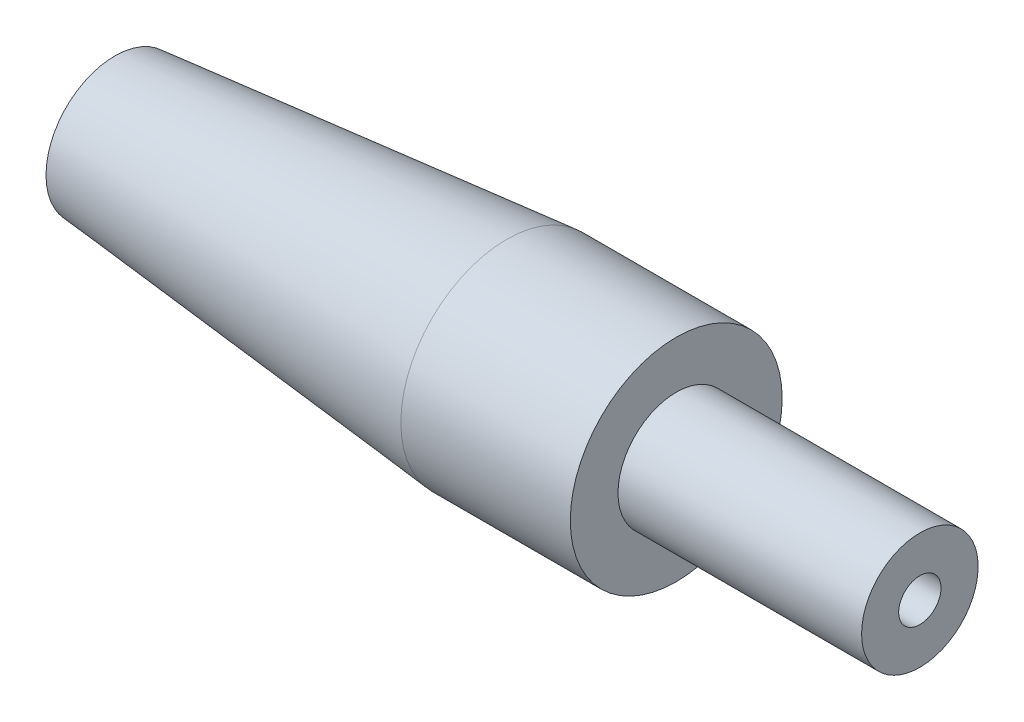
ISO-10303-21;
HEADER;
FILE_DESCRIPTION(('STEP AP214'),'2;1');
FILE_NAME('part.step','',(''),(''),'','','');
FILE_SCHEMA(('AUTOMOTIVE_DESIGN { 1 0 10303 214 1 1 1 1 }'));
ENDSEC;
DATA;
#1=APPLICATION_CONTEXT('core data for automotive mechanical design processes');
#2=APPLICATION_PROTOCOL_DEFINITION('international standard','automotive_design',2000,#1);
#3=PRODUCT_CONTEXT('',#1,'mechanical');
#4=PRODUCT('Part','Part','',(#3));
#5=PRODUCT_RELATED_PRODUCT_CATEGORY('part','',(#4));
#6=PRODUCT_DEFINITION_FORMATION('','',#4);
#7=PRODUCT_DEFINITION_CONTEXT('part definition',#1,'design');
#8=PRODUCT_DEFINITION('design','',#6,#7);
#9=PRODUCT_DEFINITION_SHAPE('','',#8);
#10=(LENGTH_UNIT() NAMED_UNIT(*) SI_UNIT(.MILLI.,.METRE.));
#11=(NAMED_UNIT(*) PLANE_ANGLE_UNIT() SI_UNIT($,.RADIAN.));
#12=(NAMED_UNIT(*) SI_UNIT($,.STERADIAN.) SOLID_ANGLE_UNIT());
#13=UNCERTAINTY_MEASURE_WITH_UNIT(LENGTH_MEASURE(1.E-05),#10,'distance_accuracy_value','');
#14=(GEOMETRIC_REPRESENTATION_CONTEXT(3) GLOBAL_UNCERTAINTY_ASSIGNED_CONTEXT((#13)) GLOBAL_UNIT_ASSIGNED_CONTEXT((#10,
#11,#12)) REPRESENTATION_CONTEXT('',''));
#15=CARTESIAN_POINT('',(0.,0.,0.));
#16=DIRECTION('',(0.,0.,1.));
#17=DIRECTION('',(1.,0.,0.));
#18=AXIS2_PLACEMENT_3D('',#15,#16,#17);
#19=CARTESIAN_POINT('',(11.5,0.,0.));
#20=DIRECTION('',(-1.,0.,0.));
#21=DIRECTION('',(0.,0.,1.));
#22=AXIS2_PLACEMENT_3D('',#19,#20,#21);
#23=PLANE('',#22);
#24=CARTESIAN_POINT('',(11.5,0.,0.));
#25=DIRECTION('',(1.,0.,0.));
#26=DIRECTION('',(0.,0.,-1.));
#27=AXIS2_PLACEMENT_3D('',#24,#25,#26);
#28=CIRCLE('',#27,1.);
#29=CARTESIAN_POINT('',(11.5,0.,-1.));
#30=VERTEX_POINT('',#29);
#31=EDGE_CURVE('E56',#30,#30,#28,.T.);
#32=ORIENTED_EDGE('',*,*,#31,.F.);
#33=EDGE_LOOP('',(#32));
#34=FACE_BOUND('',#33,.T.);
#35=CARTESIAN_POINT('',(11.5,0.,0.));
#36=DIRECTION('',(-1.,0.,0.));
#37=DIRECTION('',(0.,0.,1.));
#38=AXIS2_PLACEMENT_3D('',#35,#36,#37);
#39=CIRCLE('',#38,2.75);
#40=CARTESIAN_POINT('',(11.5,0.,2.75));
#41=VERTEX_POINT('',#40);
#42=EDGE_CURVE('E10',#41,#41,#39,.T.);
#43=ORIENTED_EDGE('',*,*,#42,.F.);
#44=EDGE_LOOP('',(#43));
#45=FACE_BOUND('',#44,.T.);
#46=ADVANCED_FACE('F33',(#34,#45),#23,.F.);
#47=CARTESIAN_POINT('',(-52.5973654879164,0.,0.));
#48=DIRECTION('',(-1.,0.,0.));
#49=DIRECTION('',(0.,0.,1.));
#50=AXIS2_PLACEMENT_3D('',#47,#48,#49);
#51=CYLINDRICAL_SURFACE('',#50,2.75);
#52=CARTESIAN_POINT('',(0.,0.,0.));
#53=DIRECTION('',(-1.,0.,0.));
#54=DIRECTION('',(0.,0.,1.));
#55=AXIS2_PLACEMENT_3D('',#52,#53,#54);
#56=CIRCLE('',#55,2.75);
#57=CARTESIAN_POINT('',(0.,0.,2.75));
#58=VERTEX_POINT('',#57);
#59=EDGE_CURVE('E39',#58,#58,#56,.T.);
#60=ORIENTED_EDGE('',*,*,#59,.F.);
#61=EDGE_LOOP('',(#60));
#62=FACE_BOUND('',#61,.T.);
#63=ORIENTED_EDGE('',*,*,#42,.T.);
#64=EDGE_LOOP('',(#63));
#65=FACE_BOUND('',#64,.T.);
#66=ADVANCED_FACE('F73',(#62,#65),#51,.T.);
#67=CARTESIAN_POINT('',(0.,0.,-2.75));
#68=DIRECTION('',(-1.,0.,0.));
#69=DIRECTION('',(0.,0.,1.));
#70=AXIS2_PLACEMENT_3D('',#67,#68,#69);
#71=PLANE('',#70);
#72=CARTESIAN_POINT('',(0.,0.,0.));
#73=DIRECTION('',(-1.,0.,0.));
#74=DIRECTION('',(0.,0.,1.));
#75=AXIS2_PLACEMENT_3D('',#72,#73,#74);
#76=CIRCLE('',#75,5.);
#77=CARTESIAN_POINT('',(0.,0.,5.));
#78=VERTEX_POINT('',#77);
#79=EDGE_CURVE('E43',#78,#78,#76,.T.);
#80=ORIENTED_EDGE('',*,*,#79,.F.);
#81=EDGE_LOOP('',(#80));
#82=FACE_BOUND('',#81,.T.);
#83=ORIENTED_EDGE('',*,*,#59,.T.);
#84=EDGE_LOOP('',(#83));
#85=FACE_BOUND('',#84,.T.);
#86=ADVANCED_FACE('F77',(#82,#85),#71,.F.);
#87=CARTESIAN_POINT('',(-52.5973654879164,0.,0.));
#88=DIRECTION('',(-1.,0.,0.));
#89=DIRECTION('',(0.,0.,1.));
#90=AXIS2_PLACEMENT_3D('',#87,#88,#89);
#91=CYLINDRICAL_SURFACE('',#90,5.);
#92=CARTESIAN_POINT('',(-8.,0.,0.));
#93=DIRECTION('',(-1.,0.,0.));
#94=DIRECTION('',(0.,0.,1.));
#95=AXIS2_PLACEMENT_3D('',#92,#93,#94);
#96=CIRCLE('',#95,5.);
#97=CARTESIAN_POINT('',(-8.,0.,5.));
#98=VERTEX_POINT('',#97);
#99=EDGE_CURVE('E47',#98,#98,#96,.T.);
#100=ORIENTED_EDGE('',*,*,#99,.F.);
#101=EDGE_LOOP('',(#100));
#102=FACE_BOUND('',#101,.T.);
#103=ORIENTED_EDGE('',*,*,#79,.T.);
#104=EDGE_LOOP('',(#103));
#105=FACE_BOUND('',#104,.T.);
#106=ADVANCED_FACE('F82',(#102,#105),#91,.T.);
#107=CARTESIAN_POINT('',(-8.,0.,0.));
#108=DIRECTION('',(1.,0.,0.));
#109=DIRECTION('',(0.,0.,-1.));
#110=AXIS2_PLACEMENT_3D('',#107,#108,#109);
#111=CONICAL_SURFACE('',#110,5.,0.0943139513271804);
#112=CARTESIAN_POINT('',(-26.5,0.,0.));
#113=DIRECTION('',(-1.,0.,0.));
#114=DIRECTION('',(0.,0.,1.));
#115=AXIS2_PLACEMENT_3D('',#112,#113,#114);
#116=CIRCLE('',#115,3.25);
#117=CARTESIAN_POINT('',(-26.5,0.,3.25));
#118=VERTEX_POINT('',#117);
#119=EDGE_CURVE('E52',#118,#118,#116,.T.);
#120=ORIENTED_EDGE('',*,*,#119,.F.);
#121=EDGE_LOOP('',(#120));
#122=FACE_BOUND('',#121,.T.);
#123=ORIENTED_EDGE('',*,*,#99,.T.);
#124=EDGE_LOOP('',(#123));
#125=FACE_BOUND('',#124,.T.);
#126=ADVANCED_FACE('F88',(#122,#125),#111,.T.);
#127=CARTESIAN_POINT('',(-26.5,0.,-3.25));
#128=DIRECTION('',(1.,0.,0.));
#129=DIRECTION('',(0.,0.,-1.));
#130=AXIS2_PLACEMENT_3D('',#127,#128,#129);
#131=PLANE('',#130);
#132=ORIENTED_EDGE('',*,*,#119,.T.);
#133=EDGE_LOOP('',(#132));
#134=FACE_BOUND('',#133,.T.);
#135=ADVANCED_FACE('F67',(#134),#131,.F.);
#136=CARTESIAN_POINT('',(3.5,0.,0.));
#137=DIRECTION('',(1.,0.,0.));
#138=DIRECTION('',(0.,0.,-1.));
#139=AXIS2_PLACEMENT_3D('',#136,#137,#138);
#140=CYLINDRICAL_SURFACE('',#139,1.);
#141=CARTESIAN_POINT('',(3.5,0.,0.));
#142=DIRECTION('',(1.,0.,0.));
#143=DIRECTION('',(0.,0.,-1.));
#144=AXIS2_PLACEMENT_3D('',#141,#142,#143);
#145=CIRCLE('',#144,1.);
#146=CARTESIAN_POINT('',(3.5,0.,-1.));
#147=VERTEX_POINT('',#146);
#148=EDGE_CURVE('E55',#147,#147,#145,.T.);
#149=ORIENTED_EDGE('',*,*,#148,.F.);
#150=EDGE_LOOP('',(#149));
#151=FACE_BOUND('',#150,.T.);
#152=ORIENTED_EDGE('',*,*,#31,.T.);
#153=EDGE_LOOP('',(#152));
#154=FACE_BOUND('',#153,.T.);
#155=ADVANCED_FACE('F64',(#151,#154),#140,.F.);
#156=CARTESIAN_POINT('',(3.5,0.,0.));
#157=DIRECTION('',(1.,0.,0.));
#158=DIRECTION('',(0.,0.,-1.));
#159=AXIS2_PLACEMENT_3D('',#156,#157,#158);
#160=PLANE('',#159);
#161=ORIENTED_EDGE('',*,*,#148,.T.);
#162=EDGE_LOOP('',(#161));
#163=FACE_BOUND('',#162,.T.);
#164=ADVANCED_FACE('F62',(#163),#160,.T.);
#165=CLOSED_SHELL('',(#46,#66,#86,#106,#126,#135,#155,#164));
#166=MANIFOLD_SOLID_BREP('B2',#165);
#167=ADVANCED_BREP_SHAPE_REPRESENTATION('',(#18,#166),#14);
#168=SHAPE_DEFINITION_REPRESENTATION(#9,#167);
ENDSEC;
END-ISO-10303-21;
